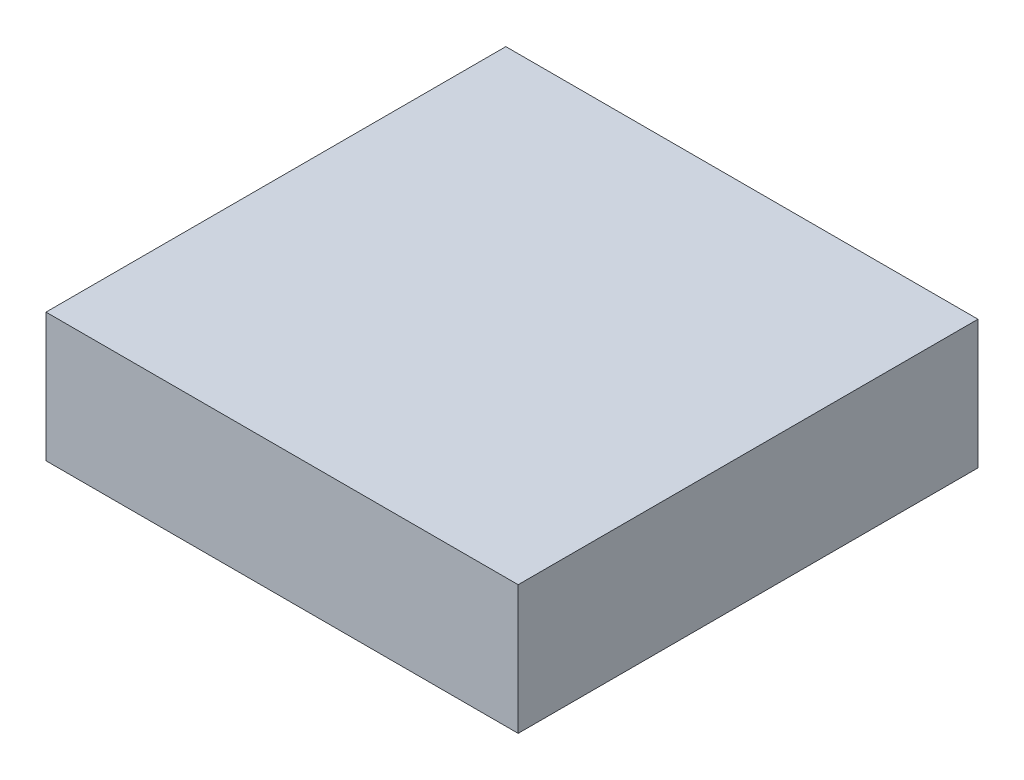
ISO-10303-21;
HEADER;
FILE_DESCRIPTION(('STEP AP214'),'2;1');
FILE_NAME('part.step','',(''),(''),'','','');
FILE_SCHEMA(('AUTOMOTIVE_DESIGN { 1 0 10303 214 1 1 1 1 }'));
ENDSEC;
DATA;
#1=APPLICATION_CONTEXT('core data for automotive mechanical design processes');
#2=APPLICATION_PROTOCOL_DEFINITION('international standard','automotive_design',2000,#1);
#3=PRODUCT_CONTEXT('',#1,'mechanical');
#4=PRODUCT('Part','Part','',(#3));
#5=PRODUCT_RELATED_PRODUCT_CATEGORY('part','',(#4));
#6=PRODUCT_DEFINITION_FORMATION('','',#4);
#7=PRODUCT_DEFINITION_CONTEXT('part definition',#1,'design');
#8=PRODUCT_DEFINITION('design','',#6,#7);
#9=PRODUCT_DEFINITION_SHAPE('','',#8);
#10=(LENGTH_UNIT() NAMED_UNIT(*) SI_UNIT(.MILLI.,.METRE.));
#11=(NAMED_UNIT(*) PLANE_ANGLE_UNIT() SI_UNIT($,.RADIAN.));
#12=(NAMED_UNIT(*) SI_UNIT($,.STERADIAN.) SOLID_ANGLE_UNIT());
#13=UNCERTAINTY_MEASURE_WITH_UNIT(LENGTH_MEASURE(1.E-05),#10,'distance_accuracy_value','');
#14=(GEOMETRIC_REPRESENTATION_CONTEXT(3) GLOBAL_UNCERTAINTY_ASSIGNED_CONTEXT((#13)) GLOBAL_UNIT_ASSIGNED_CONTEXT((#10,
#11,#12)) REPRESENTATION_CONTEXT('',''));
#15=CARTESIAN_POINT('',(0.,0.,0.));
#16=DIRECTION('',(0.,0.,1.));
#17=DIRECTION('',(1.,0.,0.));
#18=AXIS2_PLACEMENT_3D('',#15,#16,#17);
#19=CARTESIAN_POINT('',(0.,0.,32.1390625));
#20=DIRECTION('',(1.,0.,0.));
#21=DIRECTION('',(0.,0.,-1.));
#22=AXIS2_PLACEMENT_3D('',#19,#20,#21);
#23=PLANE('',#22);
#24=DIRECTION('',(0.,-1.,0.));
#25=VECTOR('',#24,1.);
#26=CARTESIAN_POINT('',(0.,0.,0.));
#27=LINE('',#26,#25);
#28=CARTESIAN_POINT('',(0.,9.,0.));
#29=VERTEX_POINT('',#28);
#30=CARTESIAN_POINT('',(0.,0.,0.));
#31=VERTEX_POINT('',#30);
#32=EDGE_CURVE('E96',#29,#31,#27,.T.);
#33=ORIENTED_EDGE('',*,*,#32,.T.);
#34=DIRECTION('',(0.,0.,-1.));
#35=VECTOR('',#34,1.);
#36=CARTESIAN_POINT('',(0.,0.,32.1390625));
#37=LINE('',#36,#35);
#38=CARTESIAN_POINT('',(0.,0.,32.1390625));
#39=VERTEX_POINT('',#38);
#40=EDGE_CURVE('E11',#39,#31,#37,.T.);
#41=ORIENTED_EDGE('',*,*,#40,.F.);
#42=DIRECTION('',(0.,-1.,0.));
#43=VECTOR('',#42,1.);
#44=CARTESIAN_POINT('',(0.,0.,32.1390625));
#45=LINE('',#44,#43);
#46=CARTESIAN_POINT('',(0.,9.,32.1390625));
#47=VERTEX_POINT('',#46);
#48=EDGE_CURVE('E84',#47,#39,#45,.T.);
#49=ORIENTED_EDGE('',*,*,#48,.F.);
#50=DIRECTION('',(0.,0.,-1.));
#51=VECTOR('',#50,1.);
#52=CARTESIAN_POINT('',(0.,9.,32.1390625));
#53=LINE('',#52,#51);
#54=EDGE_CURVE('E92',#47,#29,#53,.T.);
#55=ORIENTED_EDGE('',*,*,#54,.T.);
#56=EDGE_LOOP('',(#33,#41,#49,#55));
#57=FACE_BOUND('',#56,.T.);
#58=ADVANCED_FACE('F33',(#57),#23,.F.);
#59=CARTESIAN_POINT('',(0.,0.,32.1390625));
#60=DIRECTION('',(0.,1.,0.));
#61=DIRECTION('',(0.,0.,1.));
#62=AXIS2_PLACEMENT_3D('',#59,#60,#61);
#63=PLANE('',#62);
#64=DIRECTION('',(1.,0.,0.));
#65=VECTOR('',#64,1.);
#66=CARTESIAN_POINT('',(0.,0.,0.));
#67=LINE('',#66,#65);
#68=CARTESIAN_POINT('',(33.,0.,0.));
#69=VERTEX_POINT('',#68);
#70=EDGE_CURVE('E88',#31,#69,#67,.T.);
#71=ORIENTED_EDGE('',*,*,#70,.T.);
#72=DIRECTION('',(0.,0.,-1.));
#73=VECTOR('',#72,1.);
#74=CARTESIAN_POINT('',(33.,0.,32.1390625));
#75=LINE('',#74,#73);
#76=CARTESIAN_POINT('',(33.,0.,32.1390625));
#77=VERTEX_POINT('',#76);
#78=EDGE_CURVE('E41',#77,#69,#75,.T.);
#79=ORIENTED_EDGE('',*,*,#78,.F.);
#80=DIRECTION('',(1.,0.,0.));
#81=VECTOR('',#80,1.);
#82=CARTESIAN_POINT('',(0.,0.,32.1390625));
#83=LINE('',#82,#81);
#84=EDGE_CURVE('E79',#39,#77,#83,.T.);
#85=ORIENTED_EDGE('',*,*,#84,.F.);
#86=ORIENTED_EDGE('',*,*,#40,.T.);
#87=EDGE_LOOP('',(#71,#79,#85,#86));
#88=FACE_BOUND('',#87,.T.);
#89=ADVANCED_FACE('F87',(#88),#63,.F.);
#90=CARTESIAN_POINT('',(33.,0.,32.1390625));
#91=DIRECTION('',(-1.,0.,0.));
#92=DIRECTION('',(0.,0.,1.));
#93=AXIS2_PLACEMENT_3D('',#90,#91,#92);
#94=PLANE('',#93);
#95=DIRECTION('',(0.,1.,0.));
#96=VECTOR('',#95,1.);
#97=CARTESIAN_POINT('',(33.,0.,0.));
#98=LINE('',#97,#96);
#99=CARTESIAN_POINT('',(33.,9.,0.));
#100=VERTEX_POINT('',#99);
#101=EDGE_CURVE('E66',#69,#100,#98,.T.);
#102=ORIENTED_EDGE('',*,*,#101,.T.);
#103=DIRECTION('',(0.,0.,-1.));
#104=VECTOR('',#103,1.);
#105=CARTESIAN_POINT('',(33.,9.,32.1390625));
#106=LINE('',#105,#104);
#107=CARTESIAN_POINT('',(33.,9.,32.1390625));
#108=VERTEX_POINT('',#107);
#109=EDGE_CURVE('E89',#108,#100,#106,.T.);
#110=ORIENTED_EDGE('',*,*,#109,.F.);
#111=DIRECTION('',(0.,1.,0.));
#112=VECTOR('',#111,1.);
#113=CARTESIAN_POINT('',(33.,0.,32.1390625));
#114=LINE('',#113,#112);
#115=EDGE_CURVE('E82',#77,#108,#114,.T.);
#116=ORIENTED_EDGE('',*,*,#115,.F.);
#117=ORIENTED_EDGE('',*,*,#78,.T.);
#118=EDGE_LOOP('',(#102,#110,#116,#117));
#119=FACE_BOUND('',#118,.T.);
#120=ADVANCED_FACE('F90',(#119),#94,.F.);
#121=CARTESIAN_POINT('',(0.,9.,32.1390625));
#122=DIRECTION('',(0.,-1.,0.));
#123=DIRECTION('',(0.,0.,-1.));
#124=AXIS2_PLACEMENT_3D('',#121,#122,#123);
#125=PLANE('',#124);
#126=DIRECTION('',(-1.,0.,0.));
#127=VECTOR('',#126,1.);
#128=CARTESIAN_POINT('',(0.,9.,0.));
#129=LINE('',#128,#127);
#130=EDGE_CURVE('E72',#100,#29,#129,.T.);
#131=ORIENTED_EDGE('',*,*,#130,.T.);
#132=ORIENTED_EDGE('',*,*,#54,.F.);
#133=DIRECTION('',(-1.,0.,0.));
#134=VECTOR('',#133,1.);
#135=CARTESIAN_POINT('',(0.,9.,32.1390625));
#136=LINE('',#135,#134);
#137=EDGE_CURVE('E49',#108,#47,#136,.T.);
#138=ORIENTED_EDGE('',*,*,#137,.F.);
#139=ORIENTED_EDGE('',*,*,#109,.T.);
#140=EDGE_LOOP('',(#131,#132,#138,#139));
#141=FACE_BOUND('',#140,.T.);
#142=ADVANCED_FACE('F103',(#141),#125,.F.);
#143=CARTESIAN_POINT('',(0.,0.,32.1390625));
#144=DIRECTION('',(0.,0.,-1.));
#145=DIRECTION('',(-1.,0.,0.));
#146=AXIS2_PLACEMENT_3D('',#143,#144,#145);
#147=PLANE('',#146);
#148=ORIENTED_EDGE('',*,*,#48,.T.);
#149=ORIENTED_EDGE('',*,*,#84,.T.);
#150=ORIENTED_EDGE('',*,*,#115,.T.);
#151=ORIENTED_EDGE('',*,*,#137,.T.);
#152=EDGE_LOOP('',(#148,#149,#150,#151));
#153=FACE_BOUND('',#152,.T.);
#154=ADVANCED_FACE('F80',(#153),#147,.F.);
#155=CARTESIAN_POINT('',(0.,0.,0.));
#156=DIRECTION('',(0.,0.,-1.));
#157=DIRECTION('',(-1.,0.,0.));
#158=AXIS2_PLACEMENT_3D('',#155,#156,#157);
#159=PLANE('',#158);
#160=ORIENTED_EDGE('',*,*,#32,.F.);
#161=ORIENTED_EDGE('',*,*,#130,.F.);
#162=ORIENTED_EDGE('',*,*,#101,.F.);
#163=ORIENTED_EDGE('',*,*,#70,.F.);
#164=EDGE_LOOP('',(#160,#161,#162,#163));
#165=FACE_BOUND('',#164,.T.);
#166=ADVANCED_FACE('F106',(#165),#159,.T.);
#167=CLOSED_SHELL('',(#58,#89,#120,#142,#154,#166));
#168=MANIFOLD_SOLID_BREP('B2',#167);
#169=ADVANCED_BREP_SHAPE_REPRESENTATION('',(#18,#168),#14);
#170=SHAPE_DEFINITION_REPRESENTATION(#9,#169);
ENDSEC;
END-ISO-10303-21;
